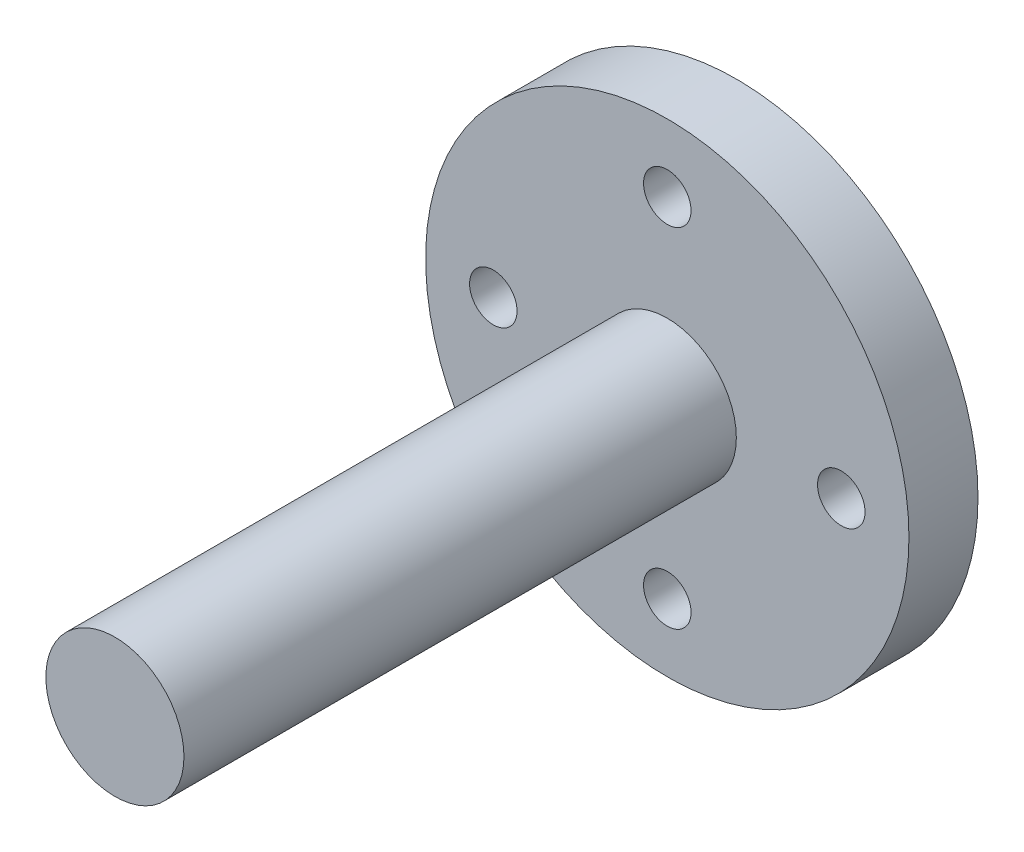
ISO-10303-21;
HEADER;
FILE_DESCRIPTION(('STEP AP214'),'2;1');
FILE_NAME('part.step','',(''),(''),'','','');
FILE_SCHEMA(('AUTOMOTIVE_DESIGN { 1 0 10303 214 1 1 1 1 }'));
ENDSEC;
DATA;
#1=APPLICATION_CONTEXT('core data for automotive mechanical design processes');
#2=APPLICATION_PROTOCOL_DEFINITION('international standard','automotive_design',2000,#1);
#3=PRODUCT_CONTEXT('',#1,'mechanical');
#4=PRODUCT('Part','Part','',(#3));
#5=PRODUCT_RELATED_PRODUCT_CATEGORY('part','',(#4));
#6=PRODUCT_DEFINITION_FORMATION('','',#4);
#7=PRODUCT_DEFINITION_CONTEXT('part definition',#1,'design');
#8=PRODUCT_DEFINITION('design','',#6,#7);
#9=PRODUCT_DEFINITION_SHAPE('','',#8);
#10=(LENGTH_UNIT() NAMED_UNIT(*) SI_UNIT(.MILLI.,.METRE.));
#11=(NAMED_UNIT(*) PLANE_ANGLE_UNIT() SI_UNIT($,.RADIAN.));
#12=(NAMED_UNIT(*) SI_UNIT($,.STERADIAN.) SOLID_ANGLE_UNIT());
#13=UNCERTAINTY_MEASURE_WITH_UNIT(LENGTH_MEASURE(1.E-05),#10,'distance_accuracy_value','');
#14=(GEOMETRIC_REPRESENTATION_CONTEXT(3) GLOBAL_UNCERTAINTY_ASSIGNED_CONTEXT((#13)) GLOBAL_UNIT_ASSIGNED_CONTEXT((#10,
#11,#12)) REPRESENTATION_CONTEXT('',''));
#15=CARTESIAN_POINT('',(0.,0.,0.));
#16=DIRECTION('',(0.,0.,1.));
#17=DIRECTION('',(1.,0.,0.));
#18=AXIS2_PLACEMENT_3D('',#15,#16,#17);
#19=CARTESIAN_POINT('',(0.,0.,3.175));
#20=DIRECTION('',(0.,0.,1.));
#21=DIRECTION('',(1.,0.,0.));
#22=AXIS2_PLACEMENT_3D('',#19,#20,#21);
#23=PLANE('',#22);
#24=CARTESIAN_POINT('',(0.,8.,3.175));
#25=DIRECTION('',(0.,0.,1.));
#26=DIRECTION('',(1.,0.,0.));
#27=AXIS2_PLACEMENT_3D('',#24,#25,#26);
#28=CIRCLE('',#27,1.09219999999999);
#29=CARTESIAN_POINT('',(1.09219999999999,8.,3.175));
#30=VERTEX_POINT('',#29);
#31=EDGE_CURVE('E69',#30,#30,#28,.T.);
#32=ORIENTED_EDGE('',*,*,#31,.F.);
#33=EDGE_LOOP('',(#32));
#34=FACE_BOUND('',#33,.T.);
#35=CARTESIAN_POINT('',(0.,-8.,3.175));
#36=DIRECTION('',(0.,0.,1.));
#37=DIRECTION('',(1.,0.,0.));
#38=AXIS2_PLACEMENT_3D('',#35,#36,#37);
#39=CIRCLE('',#38,1.09219999999999);
#40=CARTESIAN_POINT('',(1.09219999999999,-8.,3.175));
#41=VERTEX_POINT('',#40);
#42=EDGE_CURVE('E63',#41,#41,#39,.T.);
#43=ORIENTED_EDGE('',*,*,#42,.F.);
#44=EDGE_LOOP('',(#43));
#45=FACE_BOUND('',#44,.T.);
#46=CARTESIAN_POINT('',(-8.,0.,3.175));
#47=DIRECTION('',(0.,0.,1.));
#48=DIRECTION('',(1.,0.,0.));
#49=AXIS2_PLACEMENT_3D('',#46,#47,#48);
#50=CIRCLE('',#49,1.09219999999999);
#51=CARTESIAN_POINT('',(-6.90780000000001,0.,3.175));
#52=VERTEX_POINT('',#51);
#53=EDGE_CURVE('E57',#52,#52,#50,.T.);
#54=ORIENTED_EDGE('',*,*,#53,.F.);
#55=EDGE_LOOP('',(#54));
#56=FACE_BOUND('',#55,.T.);
#57=CARTESIAN_POINT('',(8.,0.,3.175));
#58=DIRECTION('',(0.,0.,1.));
#59=DIRECTION('',(1.,0.,0.));
#60=AXIS2_PLACEMENT_3D('',#57,#58,#59);
#61=CIRCLE('',#60,1.09219999999999);
#62=CARTESIAN_POINT('',(9.09219999999999,0.,3.175));
#63=VERTEX_POINT('',#62);
#64=EDGE_CURVE('E51',#63,#63,#61,.T.);
#65=ORIENTED_EDGE('',*,*,#64,.F.);
#66=EDGE_LOOP('',(#65));
#67=FACE_BOUND('',#66,.T.);
#68=CARTESIAN_POINT('',(0.,0.,3.175));
#69=DIRECTION('',(0.,0.,1.));
#70=DIRECTION('',(1.,0.,0.));
#71=AXIS2_PLACEMENT_3D('',#68,#69,#70);
#72=CIRCLE('',#71,11.1125);
#73=CARTESIAN_POINT('',(11.1125,0.,3.175));
#74=VERTEX_POINT('',#73);
#75=EDGE_CURVE('E10',#74,#74,#72,.T.);
#76=ORIENTED_EDGE('',*,*,#75,.T.);
#77=EDGE_LOOP('',(#76));
#78=FACE_BOUND('',#77,.T.);
#79=CARTESIAN_POINT('',(0.,0.,3.175));
#80=DIRECTION('',(0.,0.,1.));
#81=DIRECTION('',(1.,0.,0.));
#82=AXIS2_PLACEMENT_3D('',#79,#80,#81);
#83=CIRCLE('',#82,3.175);
#84=CARTESIAN_POINT('',(3.175,0.,3.175));
#85=VERTEX_POINT('',#84);
#86=EDGE_CURVE('E43',#85,#85,#83,.T.);
#87=ORIENTED_EDGE('',*,*,#86,.F.);
#88=EDGE_LOOP('',(#87));
#89=FACE_BOUND('',#88,.T.);
#90=ADVANCED_FACE('F30',(#34,#45,#56,#67,#78,#89),#23,.T.);
#91=CARTESIAN_POINT('',(0.,0.,3.175));
#92=DIRECTION('',(0.,0.,-1.));
#93=DIRECTION('',(-1.,0.,0.));
#94=AXIS2_PLACEMENT_3D('',#91,#92,#93);
#95=CYLINDRICAL_SURFACE('',#94,11.1125);
#96=ORIENTED_EDGE('',*,*,#75,.F.);
#97=EDGE_LOOP('',(#96));
#98=FACE_BOUND('',#97,.T.);
#99=CARTESIAN_POINT('',(0.,0.,0.));
#100=DIRECTION('',(0.,0.,1.));
#101=DIRECTION('',(1.,0.,0.));
#102=AXIS2_PLACEMENT_3D('',#99,#100,#101);
#103=CIRCLE('',#102,11.1125);
#104=CARTESIAN_POINT('',(11.1125,0.,0.));
#105=VERTEX_POINT('',#104);
#106=EDGE_CURVE('E34',#105,#105,#103,.T.);
#107=ORIENTED_EDGE('',*,*,#106,.T.);
#108=EDGE_LOOP('',(#107));
#109=FACE_BOUND('',#108,.T.);
#110=ADVANCED_FACE('F32',(#98,#109),#95,.T.);
#111=CARTESIAN_POINT('',(0.,0.,0.));
#112=DIRECTION('',(0.,0.,1.));
#113=DIRECTION('',(1.,0.,0.));
#114=AXIS2_PLACEMENT_3D('',#111,#112,#113);
#115=PLANE('',#114);
#116=CARTESIAN_POINT('',(0.,8.,0.));
#117=DIRECTION('',(0.,0.,1.));
#118=DIRECTION('',(1.,0.,0.));
#119=AXIS2_PLACEMENT_3D('',#116,#117,#118);
#120=CIRCLE('',#119,1.0922);
#121=CARTESIAN_POINT('',(1.0922,8.,0.));
#122=VERTEX_POINT('',#121);
#123=EDGE_CURVE('E66',#122,#122,#120,.T.);
#124=ORIENTED_EDGE('',*,*,#123,.T.);
#125=EDGE_LOOP('',(#124));
#126=FACE_BOUND('',#125,.T.);
#127=CARTESIAN_POINT('',(0.,-8.,0.));
#128=DIRECTION('',(0.,0.,1.));
#129=DIRECTION('',(1.,0.,0.));
#130=AXIS2_PLACEMENT_3D('',#127,#128,#129);
#131=CIRCLE('',#130,1.0922);
#132=CARTESIAN_POINT('',(1.0922,-8.,0.));
#133=VERTEX_POINT('',#132);
#134=EDGE_CURVE('E60',#133,#133,#131,.T.);
#135=ORIENTED_EDGE('',*,*,#134,.T.);
#136=EDGE_LOOP('',(#135));
#137=FACE_BOUND('',#136,.T.);
#138=CARTESIAN_POINT('',(-8.,0.,0.));
#139=DIRECTION('',(0.,0.,1.));
#140=DIRECTION('',(1.,0.,0.));
#141=AXIS2_PLACEMENT_3D('',#138,#139,#140);
#142=CIRCLE('',#141,1.0922);
#143=CARTESIAN_POINT('',(-6.9078,0.,0.));
#144=VERTEX_POINT('',#143);
#145=EDGE_CURVE('E54',#144,#144,#142,.T.);
#146=ORIENTED_EDGE('',*,*,#145,.T.);
#147=EDGE_LOOP('',(#146));
#148=FACE_BOUND('',#147,.T.);
#149=CARTESIAN_POINT('',(8.,0.,0.));
#150=DIRECTION('',(0.,0.,1.));
#151=DIRECTION('',(1.,0.,0.));
#152=AXIS2_PLACEMENT_3D('',#149,#150,#151);
#153=CIRCLE('',#152,1.0922);
#154=CARTESIAN_POINT('',(9.0922,0.,0.));
#155=VERTEX_POINT('',#154);
#156=EDGE_CURVE('E46',#155,#155,#153,.T.);
#157=ORIENTED_EDGE('',*,*,#156,.T.);
#158=EDGE_LOOP('',(#157));
#159=FACE_BOUND('',#158,.T.);
#160=ORIENTED_EDGE('',*,*,#106,.F.);
#161=EDGE_LOOP('',(#160));
#162=FACE_BOUND('',#161,.T.);
#163=ADVANCED_FACE('F89',(#126,#137,#148,#159,#162),#115,.F.);
#164=CARTESIAN_POINT('',(0.,0.,28.575));
#165=DIRECTION('',(0.,0.,-1.));
#166=DIRECTION('',(-1.,0.,0.));
#167=AXIS2_PLACEMENT_3D('',#164,#165,#166);
#168=CYLINDRICAL_SURFACE('',#167,3.175);
#169=CARTESIAN_POINT('',(0.,0.,28.575));
#170=DIRECTION('',(0.,0.,1.));
#171=DIRECTION('',(1.,0.,0.));
#172=AXIS2_PLACEMENT_3D('',#169,#170,#171);
#173=CIRCLE('',#172,3.175);
#174=CARTESIAN_POINT('',(3.175,0.,28.575));
#175=VERTEX_POINT('',#174);
#176=EDGE_CURVE('E41',#175,#175,#173,.T.);
#177=ORIENTED_EDGE('',*,*,#176,.F.);
#178=EDGE_LOOP('',(#177));
#179=FACE_BOUND('',#178,.T.);
#180=ORIENTED_EDGE('',*,*,#86,.T.);
#181=EDGE_LOOP('',(#180));
#182=FACE_BOUND('',#181,.T.);
#183=ADVANCED_FACE('F86',(#179,#182),#168,.T.);
#184=CARTESIAN_POINT('',(0.,0.,28.575));
#185=DIRECTION('',(0.,0.,1.));
#186=DIRECTION('',(1.,0.,0.));
#187=AXIS2_PLACEMENT_3D('',#184,#185,#186);
#188=PLANE('',#187);
#189=ORIENTED_EDGE('',*,*,#176,.T.);
#190=EDGE_LOOP('',(#189));
#191=FACE_BOUND('',#190,.T.);
#192=ADVANCED_FACE('F88',(#191),#188,.T.);
#193=CARTESIAN_POINT('',(8.,0.,3.175));
#194=DIRECTION('',(0.,0.,1.));
#195=DIRECTION('',(1.,0.,0.));
#196=AXIS2_PLACEMENT_3D('',#193,#194,#195);
#197=CYLINDRICAL_SURFACE('',#196,1.09219999999999);
#198=ORIENTED_EDGE('',*,*,#156,.F.);
#199=EDGE_LOOP('',(#198));
#200=FACE_BOUND('',#199,.T.);
#201=ORIENTED_EDGE('',*,*,#64,.T.);
#202=EDGE_LOOP('',(#201));
#203=FACE_BOUND('',#202,.T.);
#204=ADVANCED_FACE('F96',(#200,#203),#197,.F.);
#205=CARTESIAN_POINT('',(-8.,0.,3.175));
#206=DIRECTION('',(0.,0.,1.));
#207=DIRECTION('',(1.,0.,0.));
#208=AXIS2_PLACEMENT_3D('',#205,#206,#207);
#209=CYLINDRICAL_SURFACE('',#208,1.09219999999999);
#210=ORIENTED_EDGE('',*,*,#145,.F.);
#211=EDGE_LOOP('',(#210));
#212=FACE_BOUND('',#211,.T.);
#213=ORIENTED_EDGE('',*,*,#53,.T.);
#214=EDGE_LOOP('',(#213));
#215=FACE_BOUND('',#214,.T.);
#216=ADVANCED_FACE('F104',(#212,#215),#209,.F.);
#217=CARTESIAN_POINT('',(0.,-8.,3.175));
#218=DIRECTION('',(0.,0.,1.));
#219=DIRECTION('',(1.,0.,0.));
#220=AXIS2_PLACEMENT_3D('',#217,#218,#219);
#221=CYLINDRICAL_SURFACE('',#220,1.09219999999999);
#222=ORIENTED_EDGE('',*,*,#134,.F.);
#223=EDGE_LOOP('',(#222));
#224=FACE_BOUND('',#223,.T.);
#225=ORIENTED_EDGE('',*,*,#42,.T.);
#226=EDGE_LOOP('',(#225));
#227=FACE_BOUND('',#226,.T.);
#228=ADVANCED_FACE('F108',(#224,#227),#221,.F.);
#229=CARTESIAN_POINT('',(0.,8.,3.175));
#230=DIRECTION('',(0.,0.,1.));
#231=DIRECTION('',(1.,0.,0.));
#232=AXIS2_PLACEMENT_3D('',#229,#230,#231);
#233=CYLINDRICAL_SURFACE('',#232,1.09219999999999);
#234=ORIENTED_EDGE('',*,*,#123,.F.);
#235=EDGE_LOOP('',(#234));
#236=FACE_BOUND('',#235,.T.);
#237=ORIENTED_EDGE('',*,*,#31,.T.);
#238=EDGE_LOOP('',(#237));
#239=FACE_BOUND('',#238,.T.);
#240=ADVANCED_FACE('F73',(#236,#239),#233,.F.);
#241=CLOSED_SHELL('',(#90,#110,#163,#183,#192,#204,#216,#228,#240));
#242=MANIFOLD_SOLID_BREP('B2',#241);
#243=ADVANCED_BREP_SHAPE_REPRESENTATION('',(#18,#242),#14);
#244=SHAPE_DEFINITION_REPRESENTATION(#9,#243);
ENDSEC;
END-ISO-10303-21;
